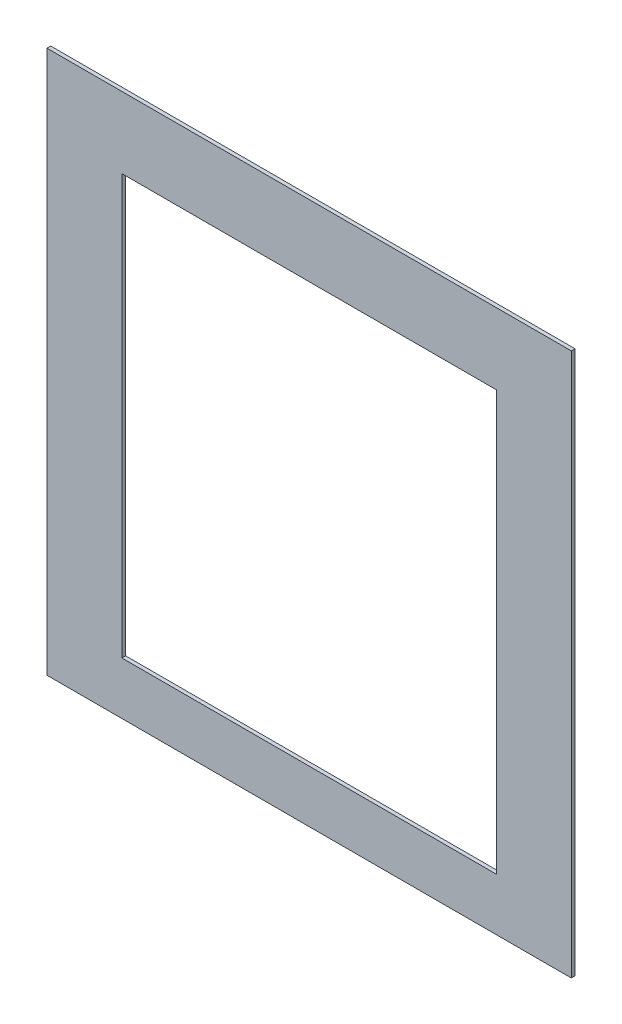
ISO-10303-21;
HEADER;
FILE_DESCRIPTION(('STEP AP214'),'2;1');
FILE_NAME('part.step','',(''),(''),'','','');
FILE_SCHEMA(('AUTOMOTIVE_DESIGN { 1 0 10303 214 1 1 1 1 }'));
ENDSEC;
DATA;
#1=APPLICATION_CONTEXT('core data for automotive mechanical design processes');
#2=APPLICATION_PROTOCOL_DEFINITION('international standard','automotive_design',2000,#1);
#3=PRODUCT_CONTEXT('',#1,'mechanical');
#4=PRODUCT('Part','Part','',(#3));
#5=PRODUCT_RELATED_PRODUCT_CATEGORY('part','',(#4));
#6=PRODUCT_DEFINITION_FORMATION('','',#4);
#7=PRODUCT_DEFINITION_CONTEXT('part definition',#1,'design');
#8=PRODUCT_DEFINITION('design','',#6,#7);
#9=PRODUCT_DEFINITION_SHAPE('','',#8);
#10=(LENGTH_UNIT() NAMED_UNIT(*) SI_UNIT(.MILLI.,.METRE.));
#11=(NAMED_UNIT(*) PLANE_ANGLE_UNIT() SI_UNIT($,.RADIAN.));
#12=(NAMED_UNIT(*) SI_UNIT($,.STERADIAN.) SOLID_ANGLE_UNIT());
#13=UNCERTAINTY_MEASURE_WITH_UNIT(LENGTH_MEASURE(1.E-05),#10,'distance_accuracy_value','');
#14=(GEOMETRIC_REPRESENTATION_CONTEXT(3) GLOBAL_UNCERTAINTY_ASSIGNED_CONTEXT((#13)) GLOBAL_UNIT_ASSIGNED_CONTEXT((#10,
#11,#12)) REPRESENTATION_CONTEXT('',''));
#15=CARTESIAN_POINT('',(0.,0.,0.));
#16=DIRECTION('',(0.,0.,1.));
#17=DIRECTION('',(1.,0.,0.));
#18=AXIS2_PLACEMENT_3D('',#15,#16,#17);
#19=CARTESIAN_POINT('',(0.,0.,155.));
#20=DIRECTION('',(0.,0.,1.));
#21=DIRECTION('',(1.,0.,0.));
#22=AXIS2_PLACEMENT_3D('',#19,#20,#21);
#23=PLANE('',#22);
#24=DIRECTION('',(0.,1.,0.));
#25=VECTOR('',#24,1.);
#26=CARTESIAN_POINT('',(350.,25.0000000000002,155.));
#27=LINE('',#26,#25);
#28=CARTESIAN_POINT('',(350.,25.0000000000002,155.));
#29=VERTEX_POINT('',#28);
#30=CARTESIAN_POINT('',(350.,750.,155.));
#31=VERTEX_POINT('',#30);
#32=EDGE_CURVE('E140',#29,#31,#27,.T.);
#33=ORIENTED_EDGE('',*,*,#32,.T.);
#34=DIRECTION('',(-1.,0.,0.));
#35=VECTOR('',#34,1.);
#36=CARTESIAN_POINT('',(350.,750.,155.));
#37=LINE('',#36,#35);
#38=CARTESIAN_POINT('',(-350.,750.,155.));
#39=VERTEX_POINT('',#38);
#40=EDGE_CURVE('E143',#31,#39,#37,.T.);
#41=ORIENTED_EDGE('',*,*,#40,.T.);
#42=DIRECTION('',(0.,-1.,0.));
#43=VECTOR('',#42,1.);
#44=CARTESIAN_POINT('',(-350.,750.,155.));
#45=LINE('',#44,#43);
#46=CARTESIAN_POINT('',(-350.,25.0000000000002,155.));
#47=VERTEX_POINT('',#46);
#48=EDGE_CURVE('E146',#39,#47,#45,.T.);
#49=ORIENTED_EDGE('',*,*,#48,.T.);
#50=DIRECTION('',(1.,0.,0.));
#51=VECTOR('',#50,1.);
#52=CARTESIAN_POINT('',(-350.,25.0000000000002,155.));
#53=LINE('',#52,#51);
#54=EDGE_CURVE('E148',#47,#29,#53,.T.);
#55=ORIENTED_EDGE('',*,*,#54,.T.);
#56=EDGE_LOOP('',(#33,#41,#49,#55));
#57=FACE_BOUND('',#56,.T.);
#58=DIRECTION('',(-1.,0.,0.));
#59=VECTOR('',#58,1.);
#60=CARTESIAN_POINT('',(-250.,655.,155.));
#61=LINE('',#60,#59);
#62=CARTESIAN_POINT('',(250.,655.,155.));
#63=VERTEX_POINT('',#62);
#64=CARTESIAN_POINT('',(-250.,655.,155.));
#65=VERTEX_POINT('',#64);
#66=EDGE_CURVE('E112',#63,#65,#61,.T.);
#67=ORIENTED_EDGE('',*,*,#66,.F.);
#68=DIRECTION('',(0.,1.,0.));
#69=VECTOR('',#68,1.);
#70=CARTESIAN_POINT('',(250.,655.,155.));
#71=LINE('',#70,#69);
#72=CARTESIAN_POINT('',(250.,95.0000000000002,155.));
#73=VERTEX_POINT('',#72);
#74=EDGE_CURVE('E104',#73,#63,#71,.T.);
#75=ORIENTED_EDGE('',*,*,#74,.F.);
#76=DIRECTION('',(1.,0.,0.));
#77=VECTOR('',#76,1.);
#78=CARTESIAN_POINT('',(-250.,95.0000000000002,155.));
#79=LINE('',#78,#77);
#80=CARTESIAN_POINT('',(-250.,95.0000000000002,155.));
#81=VERTEX_POINT('',#80);
#82=EDGE_CURVE('E126',#81,#73,#79,.T.);
#83=ORIENTED_EDGE('',*,*,#82,.F.);
#84=DIRECTION('',(0.,-1.,0.));
#85=VECTOR('',#84,1.);
#86=CARTESIAN_POINT('',(-250.,655.,155.));
#87=LINE('',#86,#85);
#88=EDGE_CURVE('E124',#65,#81,#87,.T.);
#89=ORIENTED_EDGE('',*,*,#88,.F.);
#90=EDGE_LOOP('',(#67,#75,#83,#89));
#91=FACE_BOUND('',#90,.T.);
#92=ADVANCED_FACE('F39',(#57,#91),#23,.T.);
#93=CARTESIAN_POINT('',(0.,0.,150.));
#94=DIRECTION('',(0.,0.,1.));
#95=DIRECTION('',(1.,0.,0.));
#96=AXIS2_PLACEMENT_3D('',#93,#94,#95);
#97=PLANE('',#96);
#98=DIRECTION('',(0.,1.,0.));
#99=VECTOR('',#98,1.);
#100=CARTESIAN_POINT('',(350.,25.0000000000002,150.));
#101=LINE('',#100,#99);
#102=CARTESIAN_POINT('',(350.,25.0000000000002,150.));
#103=VERTEX_POINT('',#102);
#104=CARTESIAN_POINT('',(350.,750.,150.));
#105=VERTEX_POINT('',#104);
#106=EDGE_CURVE('E120',#103,#105,#101,.T.);
#107=ORIENTED_EDGE('',*,*,#106,.F.);
#108=DIRECTION('',(1.,0.,0.));
#109=VECTOR('',#108,1.);
#110=CARTESIAN_POINT('',(-350.,25.0000000000002,150.));
#111=LINE('',#110,#109);
#112=CARTESIAN_POINT('',(-350.,25.0000000000002,150.));
#113=VERTEX_POINT('',#112);
#114=EDGE_CURVE('E144',#113,#103,#111,.T.);
#115=ORIENTED_EDGE('',*,*,#114,.F.);
#116=DIRECTION('',(0.,-1.,0.));
#117=VECTOR('',#116,1.);
#118=CARTESIAN_POINT('',(-350.,750.,150.));
#119=LINE('',#118,#117);
#120=CARTESIAN_POINT('',(-350.,750.,150.));
#121=VERTEX_POINT('',#120);
#122=EDGE_CURVE('E155',#121,#113,#119,.T.);
#123=ORIENTED_EDGE('',*,*,#122,.F.);
#124=DIRECTION('',(-1.,0.,0.));
#125=VECTOR('',#124,1.);
#126=CARTESIAN_POINT('',(350.,750.,150.));
#127=LINE('',#126,#125);
#128=EDGE_CURVE('E153',#105,#121,#127,.T.);
#129=ORIENTED_EDGE('',*,*,#128,.F.);
#130=EDGE_LOOP('',(#107,#115,#123,#129));
#131=FACE_BOUND('',#130,.T.);
#132=DIRECTION('',(0.,1.,0.));
#133=VECTOR('',#132,1.);
#134=CARTESIAN_POINT('',(250.,655.,150.));
#135=LINE('',#134,#133);
#136=CARTESIAN_POINT('',(250.,95.0000000000002,150.));
#137=VERTEX_POINT('',#136);
#138=CARTESIAN_POINT('',(250.,655.,150.));
#139=VERTEX_POINT('',#138);
#140=EDGE_CURVE('E62',#137,#139,#135,.T.);
#141=ORIENTED_EDGE('',*,*,#140,.T.);
#142=DIRECTION('',(-1.,0.,0.));
#143=VECTOR('',#142,1.);
#144=CARTESIAN_POINT('',(-250.,655.,150.));
#145=LINE('',#144,#143);
#146=CARTESIAN_POINT('',(-250.,655.,150.));
#147=VERTEX_POINT('',#146);
#148=EDGE_CURVE('E119',#139,#147,#145,.T.);
#149=ORIENTED_EDGE('',*,*,#148,.T.);
#150=DIRECTION('',(0.,-1.,0.));
#151=VECTOR('',#150,1.);
#152=CARTESIAN_POINT('',(-250.,655.,150.));
#153=LINE('',#152,#151);
#154=CARTESIAN_POINT('',(-250.,95.0000000000002,150.));
#155=VERTEX_POINT('',#154);
#156=EDGE_CURVE('E132',#147,#155,#153,.T.);
#157=ORIENTED_EDGE('',*,*,#156,.T.);
#158=DIRECTION('',(1.,0.,0.));
#159=VECTOR('',#158,1.);
#160=CARTESIAN_POINT('',(-250.,95.0000000000002,150.));
#161=LINE('',#160,#159);
#162=EDGE_CURVE('E113',#155,#137,#161,.T.);
#163=ORIENTED_EDGE('',*,*,#162,.T.);
#164=EDGE_LOOP('',(#141,#149,#157,#163));
#165=FACE_BOUND('',#164,.T.);
#166=ADVANCED_FACE('F173',(#131,#165),#97,.F.);
#167=CARTESIAN_POINT('',(350.,25.0000000000002,155.));
#168=DIRECTION('',(-1.,0.,0.));
#169=DIRECTION('',(0.,-1.,0.));
#170=AXIS2_PLACEMENT_3D('',#167,#168,#169);
#171=PLANE('',#170);
#172=ORIENTED_EDGE('',*,*,#106,.T.);
#173=DIRECTION('',(0.,0.,-1.));
#174=VECTOR('',#173,1.);
#175=CARTESIAN_POINT('',(350.,750.,155.));
#176=LINE('',#175,#174);
#177=EDGE_CURVE('E11',#31,#105,#176,.T.);
#178=ORIENTED_EDGE('',*,*,#177,.F.);
#179=ORIENTED_EDGE('',*,*,#32,.F.);
#180=DIRECTION('',(0.,0.,-1.));
#181=VECTOR('',#180,1.);
#182=CARTESIAN_POINT('',(350.,25.0000000000002,155.));
#183=LINE('',#182,#181);
#184=EDGE_CURVE('E150',#29,#103,#183,.T.);
#185=ORIENTED_EDGE('',*,*,#184,.T.);
#186=EDGE_LOOP('',(#172,#178,#179,#185));
#187=FACE_BOUND('',#186,.T.);
#188=ADVANCED_FACE('F41',(#187),#171,.F.);
#189=CARTESIAN_POINT('',(350.,750.,155.));
#190=DIRECTION('',(0.,-1.,0.));
#191=DIRECTION('',(0.,0.,-1.));
#192=AXIS2_PLACEMENT_3D('',#189,#190,#191);
#193=PLANE('',#192);
#194=ORIENTED_EDGE('',*,*,#128,.T.);
#195=DIRECTION('',(0.,0.,-1.));
#196=VECTOR('',#195,1.);
#197=CARTESIAN_POINT('',(-350.,750.,155.));
#198=LINE('',#197,#196);
#199=EDGE_CURVE('E47',#39,#121,#198,.T.);
#200=ORIENTED_EDGE('',*,*,#199,.F.);
#201=ORIENTED_EDGE('',*,*,#40,.F.);
#202=ORIENTED_EDGE('',*,*,#177,.T.);
#203=EDGE_LOOP('',(#194,#200,#201,#202));
#204=FACE_BOUND('',#203,.T.);
#205=ADVANCED_FACE('F183',(#204),#193,.F.);
#206=CARTESIAN_POINT('',(-350.,750.,155.));
#207=DIRECTION('',(1.,0.,0.));
#208=DIRECTION('',(0.,1.,0.));
#209=AXIS2_PLACEMENT_3D('',#206,#207,#208);
#210=PLANE('',#209);
#211=ORIENTED_EDGE('',*,*,#122,.T.);
#212=DIRECTION('',(0.,0.,-1.));
#213=VECTOR('',#212,1.);
#214=CARTESIAN_POINT('',(-350.,25.0000000000002,155.));
#215=LINE('',#214,#213);
#216=EDGE_CURVE('E160',#47,#113,#215,.T.);
#217=ORIENTED_EDGE('',*,*,#216,.F.);
#218=ORIENTED_EDGE('',*,*,#48,.F.);
#219=ORIENTED_EDGE('',*,*,#199,.T.);
#220=EDGE_LOOP('',(#211,#217,#218,#219));
#221=FACE_BOUND('',#220,.T.);
#222=ADVANCED_FACE('F167',(#221),#210,.F.);
#223=CARTESIAN_POINT('',(-350.,25.0000000000002,155.));
#224=DIRECTION('',(0.,1.,0.));
#225=DIRECTION('',(0.,0.,1.));
#226=AXIS2_PLACEMENT_3D('',#223,#224,#225);
#227=PLANE('',#226);
#228=ORIENTED_EDGE('',*,*,#114,.T.);
#229=ORIENTED_EDGE('',*,*,#184,.F.);
#230=ORIENTED_EDGE('',*,*,#54,.F.);
#231=ORIENTED_EDGE('',*,*,#216,.T.);
#232=EDGE_LOOP('',(#228,#229,#230,#231));
#233=FACE_BOUND('',#232,.T.);
#234=ADVANCED_FACE('F177',(#233),#227,.F.);
#235=CARTESIAN_POINT('',(250.,655.,155.));
#236=DIRECTION('',(-1.,0.,0.));
#237=DIRECTION('',(0.,0.,1.));
#238=AXIS2_PLACEMENT_3D('',#235,#236,#237);
#239=PLANE('',#238);
#240=ORIENTED_EDGE('',*,*,#140,.F.);
#241=DIRECTION('',(0.,0.,-1.));
#242=VECTOR('',#241,1.);
#243=CARTESIAN_POINT('',(250.,95.0000000000002,155.));
#244=LINE('',#243,#242);
#245=EDGE_CURVE('E108',#73,#137,#244,.T.);
#246=ORIENTED_EDGE('',*,*,#245,.F.);
#247=ORIENTED_EDGE('',*,*,#74,.T.);
#248=DIRECTION('',(0.,0.,-1.));
#249=VECTOR('',#248,1.);
#250=CARTESIAN_POINT('',(250.,655.,155.));
#251=LINE('',#250,#249);
#252=EDGE_CURVE('E107',#63,#139,#251,.T.);
#253=ORIENTED_EDGE('',*,*,#252,.T.);
#254=EDGE_LOOP('',(#240,#246,#247,#253));
#255=FACE_BOUND('',#254,.T.);
#256=ADVANCED_FACE('F106',(#255),#239,.T.);
#257=CARTESIAN_POINT('',(-250.,655.,155.));
#258=DIRECTION('',(0.,-1.,0.));
#259=DIRECTION('',(0.,0.,-1.));
#260=AXIS2_PLACEMENT_3D('',#257,#258,#259);
#261=PLANE('',#260);
#262=ORIENTED_EDGE('',*,*,#148,.F.);
#263=ORIENTED_EDGE('',*,*,#252,.F.);
#264=ORIENTED_EDGE('',*,*,#66,.T.);
#265=DIRECTION('',(0.,0.,-1.));
#266=VECTOR('',#265,1.);
#267=CARTESIAN_POINT('',(-250.,655.,155.));
#268=LINE('',#267,#266);
#269=EDGE_CURVE('E121',#65,#147,#268,.T.);
#270=ORIENTED_EDGE('',*,*,#269,.T.);
#271=EDGE_LOOP('',(#262,#263,#264,#270));
#272=FACE_BOUND('',#271,.T.);
#273=ADVANCED_FACE('F116',(#272),#261,.T.);
#274=CARTESIAN_POINT('',(-250.,655.,155.));
#275=DIRECTION('',(1.,0.,0.));
#276=DIRECTION('',(0.,0.,-1.));
#277=AXIS2_PLACEMENT_3D('',#274,#275,#276);
#278=PLANE('',#277);
#279=ORIENTED_EDGE('',*,*,#156,.F.);
#280=ORIENTED_EDGE('',*,*,#269,.F.);
#281=ORIENTED_EDGE('',*,*,#88,.T.);
#282=DIRECTION('',(0.,0.,-1.));
#283=VECTOR('',#282,1.);
#284=CARTESIAN_POINT('',(-250.,95.0000000000002,155.));
#285=LINE('',#284,#283);
#286=EDGE_CURVE('E54',#81,#155,#285,.T.);
#287=ORIENTED_EDGE('',*,*,#286,.T.);
#288=EDGE_LOOP('',(#279,#280,#281,#287));
#289=FACE_BOUND('',#288,.T.);
#290=ADVANCED_FACE('F206',(#289),#278,.T.);
#291=CARTESIAN_POINT('',(-250.,95.0000000000002,155.));
#292=DIRECTION('',(0.,1.,0.));
#293=DIRECTION('',(0.,0.,1.));
#294=AXIS2_PLACEMENT_3D('',#291,#292,#293);
#295=PLANE('',#294);
#296=ORIENTED_EDGE('',*,*,#162,.F.);
#297=ORIENTED_EDGE('',*,*,#286,.F.);
#298=ORIENTED_EDGE('',*,*,#82,.T.);
#299=ORIENTED_EDGE('',*,*,#245,.T.);
#300=EDGE_LOOP('',(#296,#297,#298,#299));
#301=FACE_BOUND('',#300,.T.);
#302=ADVANCED_FACE('F210',(#301),#295,.T.);
#303=CLOSED_SHELL('',(#92,#166,#188,#205,#222,#234,#256,#273,#290,#302));
#304=MANIFOLD_SOLID_BREP('B2',#303);
#305=ADVANCED_BREP_SHAPE_REPRESENTATION('',(#18,#304),#14);
#306=SHAPE_DEFINITION_REPRESENTATION(#9,#305);
ENDSEC;
END-ISO-10303-21;
